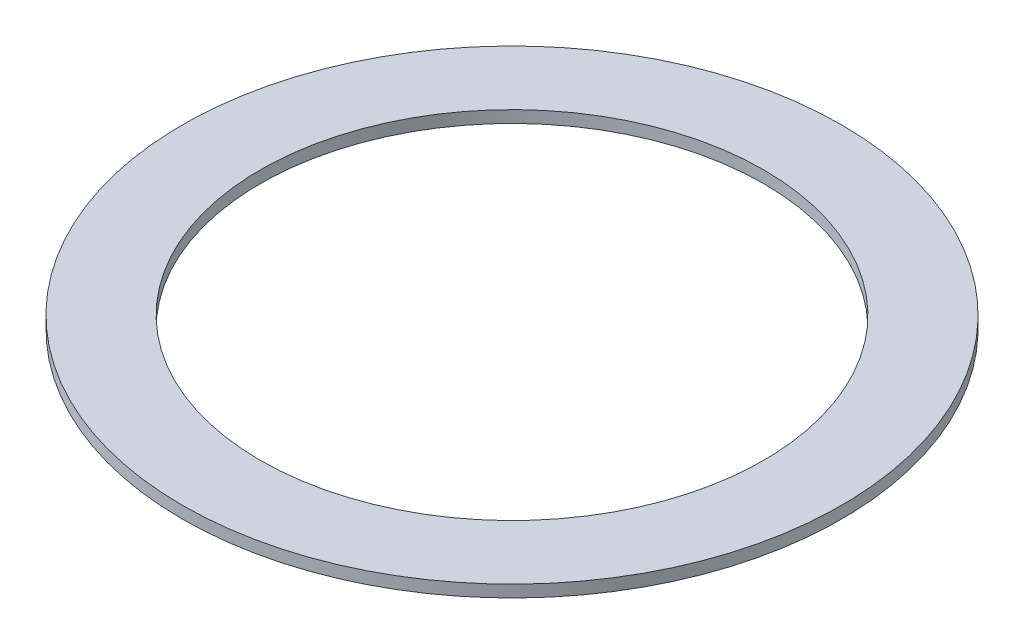
ISO-10303-21;
HEADER;
FILE_DESCRIPTION(('STEP AP214'),'2;1');
FILE_NAME('part.step','',(''),(''),'','','');
FILE_SCHEMA(('AUTOMOTIVE_DESIGN { 1 0 10303 214 1 1 1 1 }'));
ENDSEC;
DATA;
#1=APPLICATION_CONTEXT('core data for automotive mechanical design processes');
#2=APPLICATION_PROTOCOL_DEFINITION('international standard','automotive_design',2000,#1);
#3=PRODUCT_CONTEXT('',#1,'mechanical');
#4=PRODUCT('Part','Part','',(#3));
#5=PRODUCT_RELATED_PRODUCT_CATEGORY('part','',(#4));
#6=PRODUCT_DEFINITION_FORMATION('','',#4);
#7=PRODUCT_DEFINITION_CONTEXT('part definition',#1,'design');
#8=PRODUCT_DEFINITION('design','',#6,#7);
#9=PRODUCT_DEFINITION_SHAPE('','',#8);
#10=(LENGTH_UNIT() NAMED_UNIT(*) SI_UNIT(.MILLI.,.METRE.));
#11=(NAMED_UNIT(*) PLANE_ANGLE_UNIT() SI_UNIT($,.RADIAN.));
#12=(NAMED_UNIT(*) SI_UNIT($,.STERADIAN.) SOLID_ANGLE_UNIT());
#13=UNCERTAINTY_MEASURE_WITH_UNIT(LENGTH_MEASURE(1.E-05),#10,'distance_accuracy_value','');
#14=(GEOMETRIC_REPRESENTATION_CONTEXT(3) GLOBAL_UNCERTAINTY_ASSIGNED_CONTEXT((#13)) GLOBAL_UNIT_ASSIGNED_CONTEXT((#10,
#11,#12)) REPRESENTATION_CONTEXT('',''));
#15=CARTESIAN_POINT('',(0.,0.,0.));
#16=DIRECTION('',(0.,0.,1.));
#17=DIRECTION('',(1.,0.,0.));
#18=AXIS2_PLACEMENT_3D('',#15,#16,#17);
#19=CARTESIAN_POINT('',(0.,1.,0.));
#20=DIRECTION('',(0.,1.,0.));
#21=DIRECTION('',(0.,0.,1.));
#22=AXIS2_PLACEMENT_3D('',#19,#20,#21);
#23=PLANE('',#22);
#24=CARTESIAN_POINT('',(0.,1.,0.));
#25=DIRECTION('',(0.,1.,0.));
#26=DIRECTION('',(0.,0.,1.));
#27=AXIS2_PLACEMENT_3D('',#24,#25,#26);
#28=CIRCLE('',#27,27.5);
#29=CARTESIAN_POINT('',(0.,1.,27.5));
#30=VERTEX_POINT('',#29);
#31=EDGE_CURVE('E11',#30,#30,#28,.T.);
#32=ORIENTED_EDGE('',*,*,#31,.T.);
#33=EDGE_LOOP('',(#32));
#34=FACE_BOUND('',#33,.T.);
#35=CARTESIAN_POINT('',(0.,1.,0.));
#36=DIRECTION('',(0.,1.,0.));
#37=DIRECTION('',(0.,0.,1.));
#38=AXIS2_PLACEMENT_3D('',#35,#36,#37);
#39=CIRCLE('',#38,21.);
#40=CARTESIAN_POINT('',(0.,1.,21.));
#41=VERTEX_POINT('',#40);
#42=EDGE_CURVE('E48',#41,#41,#39,.T.);
#43=ORIENTED_EDGE('',*,*,#42,.F.);
#44=EDGE_LOOP('',(#43));
#45=FACE_BOUND('',#44,.T.);
#46=ADVANCED_FACE('F37',(#34,#45),#23,.T.);
#47=CARTESIAN_POINT('',(0.,0.,0.));
#48=DIRECTION('',(0.,1.,0.));
#49=DIRECTION('',(0.,0.,1.));
#50=AXIS2_PLACEMENT_3D('',#47,#48,#49);
#51=PLANE('',#50);
#52=CARTESIAN_POINT('',(0.,0.,0.));
#53=DIRECTION('',(0.,1.,0.));
#54=DIRECTION('',(0.,0.,1.));
#55=AXIS2_PLACEMENT_3D('',#52,#53,#54);
#56=CIRCLE('',#55,27.5);
#57=CARTESIAN_POINT('',(0.,0.,27.5));
#58=VERTEX_POINT('',#57);
#59=EDGE_CURVE('E41',#58,#58,#56,.T.);
#60=ORIENTED_EDGE('',*,*,#59,.F.);
#61=EDGE_LOOP('',(#60));
#62=FACE_BOUND('',#61,.T.);
#63=CARTESIAN_POINT('',(0.,0.,0.));
#64=DIRECTION('',(0.,1.,0.));
#65=DIRECTION('',(0.,0.,1.));
#66=AXIS2_PLACEMENT_3D('',#63,#64,#65);
#67=CIRCLE('',#66,21.);
#68=CARTESIAN_POINT('',(0.,0.,21.));
#69=VERTEX_POINT('',#68);
#70=EDGE_CURVE('E50',#69,#69,#67,.T.);
#71=ORIENTED_EDGE('',*,*,#70,.T.);
#72=EDGE_LOOP('',(#71));
#73=FACE_BOUND('',#72,.T.);
#74=ADVANCED_FACE('F60',(#62,#73),#51,.F.);
#75=CARTESIAN_POINT('',(0.,1.,0.));
#76=DIRECTION('',(0.,-1.,0.));
#77=DIRECTION('',(0.,0.,-1.));
#78=AXIS2_PLACEMENT_3D('',#75,#76,#77);
#79=CYLINDRICAL_SURFACE('',#78,27.5);
#80=ORIENTED_EDGE('',*,*,#31,.F.);
#81=EDGE_LOOP('',(#80));
#82=FACE_BOUND('',#81,.T.);
#83=ORIENTED_EDGE('',*,*,#59,.T.);
#84=EDGE_LOOP('',(#83));
#85=FACE_BOUND('',#84,.T.);
#86=ADVANCED_FACE('F39',(#82,#85),#79,.T.);
#87=CARTESIAN_POINT('',(0.,1.,0.));
#88=DIRECTION('',(0.,-1.,0.));
#89=DIRECTION('',(0.,0.,-1.));
#90=AXIS2_PLACEMENT_3D('',#87,#88,#89);
#91=CYLINDRICAL_SURFACE('',#90,21.);
#92=ORIENTED_EDGE('',*,*,#42,.T.);
#93=EDGE_LOOP('',(#92));
#94=FACE_BOUND('',#93,.T.);
#95=ORIENTED_EDGE('',*,*,#70,.F.);
#96=EDGE_LOOP('',(#95));
#97=FACE_BOUND('',#96,.T.);
#98=ADVANCED_FACE('F56',(#94,#97),#91,.F.);
#99=CLOSED_SHELL('',(#46,#74,#86,#98));
#100=MANIFOLD_SOLID_BREP('B2',#99);
#101=ADVANCED_BREP_SHAPE_REPRESENTATION('',(#18,#100),#14);
#102=SHAPE_DEFINITION_REPRESENTATION(#9,#101);
ENDSEC;
END-ISO-10303-21;
